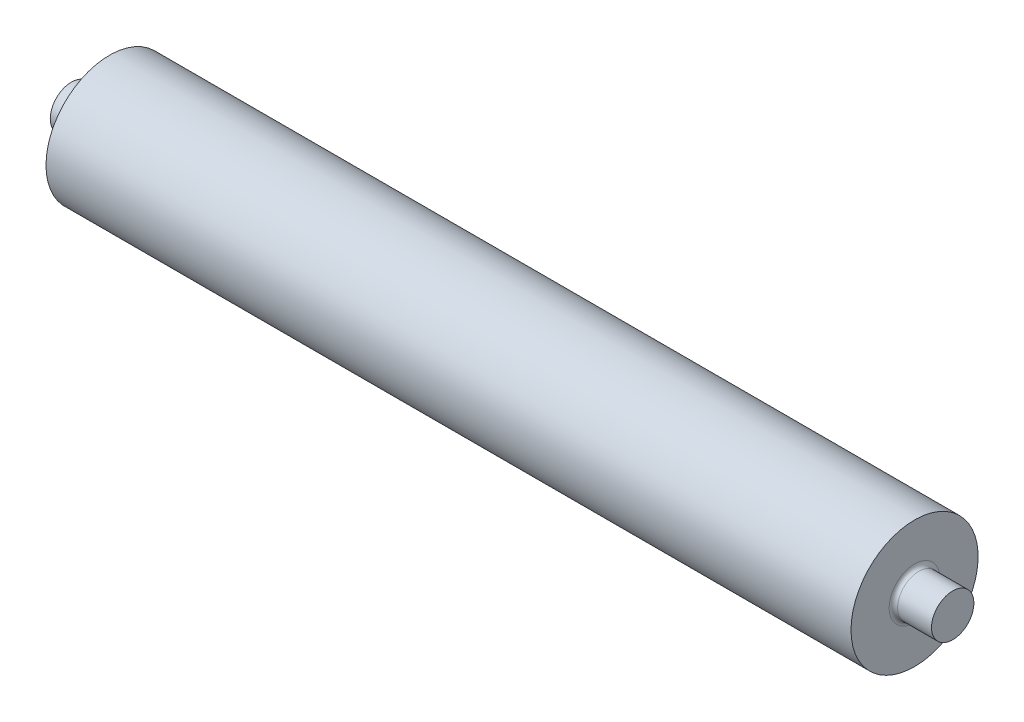
ISO-10303-21;
HEADER;
FILE_DESCRIPTION(('STEP AP214'),'2;1');
FILE_NAME('part.step','',(''),(''),'','','');
FILE_SCHEMA(('AUTOMOTIVE_DESIGN { 1 0 10303 214 1 1 1 1 }'));
ENDSEC;
DATA;
#1=APPLICATION_CONTEXT('core data for automotive mechanical design processes');
#2=APPLICATION_PROTOCOL_DEFINITION('international standard','automotive_design',2000,#1);
#3=PRODUCT_CONTEXT('',#1,'mechanical');
#4=PRODUCT('Part','Part','',(#3));
#5=PRODUCT_RELATED_PRODUCT_CATEGORY('part','',(#4));
#6=PRODUCT_DEFINITION_FORMATION('','',#4);
#7=PRODUCT_DEFINITION_CONTEXT('part definition',#1,'design');
#8=PRODUCT_DEFINITION('design','',#6,#7);
#9=PRODUCT_DEFINITION_SHAPE('','',#8);
#10=(LENGTH_UNIT() NAMED_UNIT(*) SI_UNIT(.MILLI.,.METRE.));
#11=(NAMED_UNIT(*) PLANE_ANGLE_UNIT() SI_UNIT($,.RADIAN.));
#12=(NAMED_UNIT(*) SI_UNIT($,.STERADIAN.) SOLID_ANGLE_UNIT());
#13=UNCERTAINTY_MEASURE_WITH_UNIT(LENGTH_MEASURE(1.E-05),#10,'distance_accuracy_value','');
#14=(GEOMETRIC_REPRESENTATION_CONTEXT(3) GLOBAL_UNCERTAINTY_ASSIGNED_CONTEXT((#13)) GLOBAL_UNIT_ASSIGNED_CONTEXT((#10,
#11,#12)) REPRESENTATION_CONTEXT('',''));
#15=CARTESIAN_POINT('',(0.,0.,0.));
#16=DIRECTION('',(0.,0.,1.));
#17=DIRECTION('',(1.,0.,0.));
#18=AXIS2_PLACEMENT_3D('',#15,#16,#17);
#19=CARTESIAN_POINT('',(1040.,0.,0.));
#20=DIRECTION('',(-1.,0.,0.));
#21=DIRECTION('',(0.,0.,1.));
#22=AXIS2_PLACEMENT_3D('',#19,#20,#21);
#23=PLANE('',#22);
#24=CARTESIAN_POINT('',(1040.,0.,0.));
#25=DIRECTION('',(-1.,0.,0.));
#26=DIRECTION('',(0.,0.,1.));
#27=AXIS2_PLACEMENT_3D('',#24,#25,#26);
#28=CIRCLE('',#27,50.);
#29=CARTESIAN_POINT('',(1040.,0.,50.));
#30=VERTEX_POINT('',#29);
#31=EDGE_CURVE('E52',#30,#30,#28,.T.);
#32=ORIENTED_EDGE('',*,*,#31,.F.);
#33=EDGE_LOOP('',(#32));
#34=FACE_BOUND('',#33,.T.);
#35=ADVANCED_FACE('F32',(#34),#23,.F.);
#36=CARTESIAN_POINT('',(-1040.,0.,0.));
#37=DIRECTION('',(-1.,0.,0.));
#38=DIRECTION('',(0.,0.,1.));
#39=AXIS2_PLACEMENT_3D('',#36,#37,#38);
#40=CYLINDRICAL_SURFACE('',#39,50.);
#41=CARTESIAN_POINT('',(960.,0.,0.));
#42=DIRECTION('',(-1.,0.,0.));
#43=DIRECTION('',(0.,0.,1.));
#44=AXIS2_PLACEMENT_3D('',#41,#42,#43);
#45=CIRCLE('',#44,50.);
#46=CARTESIAN_POINT('',(960.,0.,50.));
#47=VERTEX_POINT('',#46);
#48=EDGE_CURVE('E10',#47,#47,#45,.F.);
#49=ORIENTED_EDGE('',*,*,#48,.T.);
#50=EDGE_LOOP('',(#49));
#51=FACE_BOUND('',#50,.T.);
#52=ORIENTED_EDGE('',*,*,#31,.T.);
#53=EDGE_LOOP('',(#52));
#54=FACE_BOUND('',#53,.T.);
#55=ADVANCED_FACE('F82',(#51,#54),#40,.T.);
#56=CARTESIAN_POINT('',(950.,50.,0.));
#57=DIRECTION('',(-1.,0.,0.));
#58=DIRECTION('',(0.,0.,1.));
#59=AXIS2_PLACEMENT_3D('',#56,#57,#58);
#60=PLANE('',#59);
#61=CARTESIAN_POINT('',(950.,0.,0.));
#62=DIRECTION('',(-1.,0.,0.));
#63=DIRECTION('',(0.,0.,1.));
#64=AXIS2_PLACEMENT_3D('',#61,#62,#63);
#65=CIRCLE('',#64,60.);
#66=CARTESIAN_POINT('',(950.,0.,60.));
#67=VERTEX_POINT('',#66);
#68=EDGE_CURVE('E39',#67,#67,#65,.T.);
#69=ORIENTED_EDGE('',*,*,#68,.T.);
#70=EDGE_LOOP('',(#69));
#71=FACE_BOUND('',#70,.T.);
#72=CARTESIAN_POINT('',(950.,0.,0.));
#73=DIRECTION('',(-1.,0.,0.));
#74=DIRECTION('',(0.,0.,1.));
#75=AXIS2_PLACEMENT_3D('',#72,#73,#74);
#76=CIRCLE('',#75,150.);
#77=CARTESIAN_POINT('',(950.,0.,150.));
#78=VERTEX_POINT('',#77);
#79=EDGE_CURVE('E55',#78,#78,#76,.T.);
#80=ORIENTED_EDGE('',*,*,#79,.F.);
#81=EDGE_LOOP('',(#80));
#82=FACE_BOUND('',#81,.T.);
#83=ADVANCED_FACE('F88',(#71,#82),#60,.F.);
#84=CARTESIAN_POINT('',(-1040.,0.,0.));
#85=DIRECTION('',(-1.,0.,0.));
#86=DIRECTION('',(0.,0.,1.));
#87=AXIS2_PLACEMENT_3D('',#84,#85,#86);
#88=CYLINDRICAL_SURFACE('',#87,150.);
#89=CARTESIAN_POINT('',(-950.,0.,0.));
#90=DIRECTION('',(-1.,0.,0.));
#91=DIRECTION('',(0.,0.,1.));
#92=AXIS2_PLACEMENT_3D('',#89,#90,#91);
#93=CIRCLE('',#92,150.);
#94=CARTESIAN_POINT('',(-950.,0.,150.));
#95=VERTEX_POINT('',#94);
#96=EDGE_CURVE('E58',#95,#95,#93,.T.);
#97=ORIENTED_EDGE('',*,*,#96,.F.);
#98=EDGE_LOOP('',(#97));
#99=FACE_BOUND('',#98,.T.);
#100=ORIENTED_EDGE('',*,*,#79,.T.);
#101=EDGE_LOOP('',(#100));
#102=FACE_BOUND('',#101,.T.);
#103=ADVANCED_FACE('F78',(#99,#102),#88,.T.);
#104=CARTESIAN_POINT('',(-950.,50.,0.));
#105=DIRECTION('',(1.,0.,0.));
#106=DIRECTION('',(0.,0.,-1.));
#107=AXIS2_PLACEMENT_3D('',#104,#105,#106);
#108=PLANE('',#107);
#109=CARTESIAN_POINT('',(-950.,0.,0.));
#110=DIRECTION('',(1.,0.,0.));
#111=DIRECTION('',(0.,0.,-1.));
#112=AXIS2_PLACEMENT_3D('',#109,#110,#111);
#113=CIRCLE('',#112,60.);
#114=CARTESIAN_POINT('',(-950.,0.,-60.));
#115=VERTEX_POINT('',#114);
#116=EDGE_CURVE('E43',#115,#115,#113,.T.);
#117=ORIENTED_EDGE('',*,*,#116,.T.);
#118=EDGE_LOOP('',(#117));
#119=FACE_BOUND('',#118,.T.);
#120=ORIENTED_EDGE('',*,*,#96,.T.);
#121=EDGE_LOOP('',(#120));
#122=FACE_BOUND('',#121,.T.);
#123=ADVANCED_FACE('F69',(#119,#122),#108,.F.);
#124=CARTESIAN_POINT('',(-1040.,0.,0.));
#125=DIRECTION('',(-1.,0.,0.));
#126=DIRECTION('',(0.,0.,1.));
#127=AXIS2_PLACEMENT_3D('',#124,#125,#126);
#128=CYLINDRICAL_SURFACE('',#127,50.);
#129=CARTESIAN_POINT('',(-960.,0.,0.));
#130=DIRECTION('',(1.,0.,0.));
#131=DIRECTION('',(0.,0.,-1.));
#132=AXIS2_PLACEMENT_3D('',#129,#130,#131);
#133=CIRCLE('',#132,50.);
#134=CARTESIAN_POINT('',(-960.,0.,-50.));
#135=VERTEX_POINT('',#134);
#136=EDGE_CURVE('E47',#135,#135,#133,.F.);
#137=ORIENTED_EDGE('',*,*,#136,.T.);
#138=EDGE_LOOP('',(#137));
#139=FACE_BOUND('',#138,.T.);
#140=CARTESIAN_POINT('',(-1040.,0.,0.));
#141=DIRECTION('',(-1.,0.,0.));
#142=DIRECTION('',(0.,0.,1.));
#143=AXIS2_PLACEMENT_3D('',#140,#141,#142);
#144=CIRCLE('',#143,50.);
#145=CARTESIAN_POINT('',(-1040.,0.,50.));
#146=VERTEX_POINT('',#145);
#147=EDGE_CURVE('E61',#146,#146,#144,.T.);
#148=ORIENTED_EDGE('',*,*,#147,.F.);
#149=EDGE_LOOP('',(#148));
#150=FACE_BOUND('',#149,.T.);
#151=ADVANCED_FACE('F67',(#139,#150),#128,.T.);
#152=CARTESIAN_POINT('',(-1040.,0.,0.));
#153=DIRECTION('',(1.,0.,0.));
#154=DIRECTION('',(0.,0.,-1.));
#155=AXIS2_PLACEMENT_3D('',#152,#153,#154);
#156=PLANE('',#155);
#157=ORIENTED_EDGE('',*,*,#147,.T.);
#158=EDGE_LOOP('',(#157));
#159=FACE_BOUND('',#158,.T.);
#160=ADVANCED_FACE('F65',(#159),#156,.F.);
#161=CARTESIAN_POINT('',(-960.,0.,0.));
#162=DIRECTION('',(1.,0.,0.));
#163=DIRECTION('',(0.,0.,-1.));
#164=AXIS2_PLACEMENT_3D('',#161,#162,#163);
#165=TOROIDAL_SURFACE('',#164,60.,10.);
#166=ORIENTED_EDGE('',*,*,#116,.F.);
#167=EDGE_LOOP('',(#166));
#168=FACE_BOUND('',#167,.T.);
#169=ORIENTED_EDGE('',*,*,#136,.F.);
#170=EDGE_LOOP('',(#169));
#171=FACE_BOUND('',#170,.T.);
#172=ADVANCED_FACE('F76',(#168,#171),#165,.F.);
#173=CARTESIAN_POINT('',(960.,0.,0.));
#174=DIRECTION('',(-1.,0.,0.));
#175=DIRECTION('',(0.,0.,1.));
#176=AXIS2_PLACEMENT_3D('',#173,#174,#175);
#177=TOROIDAL_SURFACE('',#176,60.,10.);
#178=ORIENTED_EDGE('',*,*,#48,.F.);
#179=EDGE_LOOP('',(#178));
#180=FACE_BOUND('',#179,.T.);
#181=ORIENTED_EDGE('',*,*,#68,.F.);
#182=EDGE_LOOP('',(#181));
#183=FACE_BOUND('',#182,.T.);
#184=ADVANCED_FACE('F34',(#180,#183),#177,.F.);
#185=CLOSED_SHELL('',(#35,#55,#83,#103,#123,#151,#160,#172,#184));
#186=MANIFOLD_SOLID_BREP('B2',#185);
#187=ADVANCED_BREP_SHAPE_REPRESENTATION('',(#18,#186),#14);
#188=SHAPE_DEFINITION_REPRESENTATION(#9,#187);
ENDSEC;
END-ISO-10303-21;
